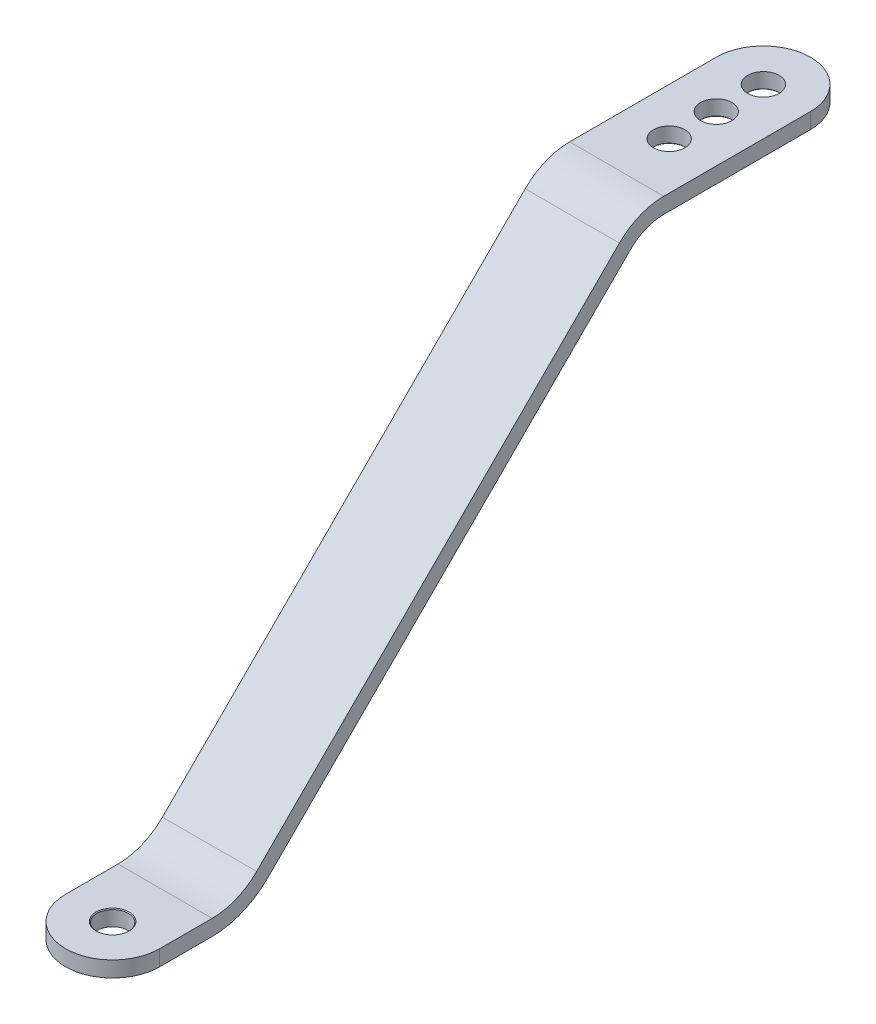
ISO-10303-21;
HEADER;
FILE_DESCRIPTION(('STEP AP214'),'2;1');
FILE_NAME('part.step','',(''),(''),'','','');
FILE_SCHEMA(('AUTOMOTIVE_DESIGN { 1 0 10303 214 1 1 1 1 }'));
ENDSEC;
DATA;
#1=APPLICATION_CONTEXT('core data for automotive mechanical design processes');
#2=APPLICATION_PROTOCOL_DEFINITION('international standard','automotive_design',2000,#1);
#3=PRODUCT_CONTEXT('',#1,'mechanical');
#4=PRODUCT('Part','Part','',(#3));
#5=PRODUCT_RELATED_PRODUCT_CATEGORY('part','',(#4));
#6=PRODUCT_DEFINITION_FORMATION('','',#4);
#7=PRODUCT_DEFINITION_CONTEXT('part definition',#1,'design');
#8=PRODUCT_DEFINITION('design','',#6,#7);
#9=PRODUCT_DEFINITION_SHAPE('','',#8);
#10=(LENGTH_UNIT() NAMED_UNIT(*) SI_UNIT(.MILLI.,.METRE.));
#11=(NAMED_UNIT(*) PLANE_ANGLE_UNIT() SI_UNIT($,.RADIAN.));
#12=(NAMED_UNIT(*) SI_UNIT($,.STERADIAN.) SOLID_ANGLE_UNIT());
#13=UNCERTAINTY_MEASURE_WITH_UNIT(LENGTH_MEASURE(1.E-05),#10,'distance_accuracy_value','');
#14=(GEOMETRIC_REPRESENTATION_CONTEXT(3) GLOBAL_UNCERTAINTY_ASSIGNED_CONTEXT((#13)) GLOBAL_UNIT_ASSIGNED_CONTEXT((#10,
#11,#12)) REPRESENTATION_CONTEXT('',''));
#15=CARTESIAN_POINT('',(0.,0.,0.));
#16=DIRECTION('',(0.,0.,1.));
#17=DIRECTION('',(1.,0.,0.));
#18=AXIS2_PLACEMENT_3D('',#15,#16,#17);
#19=CARTESIAN_POINT('',(38.1,323.28922035849,-301.344610179244));
#20=DIRECTION('',(0.,1.,0.));
#21=DIRECTION('',(0.,0.,1.));
#22=AXIS2_PLACEMENT_3D('',#19,#20,#21);
#23=CYLINDRICAL_SURFACE('',#22,38.1);
#24=DIRECTION('',(0.,1.,0.));
#25=VECTOR('',#24,1.);
#26=CARTESIAN_POINT('',(0.,50.8,-301.344610179244));
#27=LINE('',#26,#25);
#28=CARTESIAN_POINT('',(0.,323.28922035849,-301.344610179244));
#29=VERTEX_POINT('',#28);
#30=CARTESIAN_POINT('',(0.,310.58922035849,-301.344610179244));
#31=VERTEX_POINT('',#30);
#32=EDGE_CURVE('E218',#29,#31,#27,.F.);
#33=ORIENTED_EDGE('',*,*,#32,.F.);
#34=CARTESIAN_POINT('',(38.1,323.28922035849,-301.344610179244));
#35=DIRECTION('',(0.,-1.,0.));
#36=DIRECTION('',(0.,0.,-1.));
#37=AXIS2_PLACEMENT_3D('',#34,#35,#36);
#38=CIRCLE('',#37,38.1);
#39=CARTESIAN_POINT('',(76.2,323.28922035849,-301.344610179244));
#40=VERTEX_POINT('',#39);
#41=EDGE_CURVE('E47',#40,#29,#38,.F.);
#42=ORIENTED_EDGE('',*,*,#41,.F.);
#43=DIRECTION('',(0.,-1.,0.));
#44=VECTOR('',#43,1.);
#45=CARTESIAN_POINT('',(76.2,323.28922035849,-301.344610179244));
#46=LINE('',#45,#44);
#47=CARTESIAN_POINT('',(76.2,310.58922035849,-301.344610179244));
#48=VERTEX_POINT('',#47);
#49=EDGE_CURVE('E225',#48,#40,#46,.F.);
#50=ORIENTED_EDGE('',*,*,#49,.F.);
#51=CARTESIAN_POINT('',(38.1,310.58922035849,-301.344610179244));
#52=DIRECTION('',(0.,1.,0.));
#53=DIRECTION('',(0.,0.,1.));
#54=AXIS2_PLACEMENT_3D('',#51,#52,#53);
#55=CIRCLE('',#54,38.1);
#56=EDGE_CURVE('E11',#31,#48,#55,.F.);
#57=ORIENTED_EDGE('',*,*,#56,.F.);
#58=EDGE_LOOP('',(#33,#42,#50,#57));
#59=FACE_BOUND('',#58,.T.);
#60=ADVANCED_FACE('F41',(#59),#23,.T.);
#61=CARTESIAN_POINT('',(38.1,0.,225.144610179244));
#62=DIRECTION('',(0.,-1.,0.));
#63=DIRECTION('',(0.,0.,-1.));
#64=AXIS2_PLACEMENT_3D('',#61,#62,#63);
#65=CYLINDRICAL_SURFACE('',#64,38.1);
#66=DIRECTION('',(0.,1.,0.));
#67=VECTOR('',#66,1.);
#68=CARTESIAN_POINT('',(76.2,0.,225.144610179244));
#69=LINE('',#68,#67);
#70=CARTESIAN_POINT('',(76.2,0.,225.144610179244));
#71=VERTEX_POINT('',#70);
#72=CARTESIAN_POINT('',(76.2,-12.7,225.144610179244));
#73=VERTEX_POINT('',#72);
#74=EDGE_CURVE('E140',#71,#73,#69,.F.);
#75=ORIENTED_EDGE('',*,*,#74,.F.);
#76=CARTESIAN_POINT('',(38.1,0.,225.144610179244));
#77=DIRECTION('',(0.,-1.,0.));
#78=DIRECTION('',(0.,0.,-1.));
#79=AXIS2_PLACEMENT_3D('',#76,#77,#78);
#80=CIRCLE('',#79,38.1);
#81=CARTESIAN_POINT('',(0.,0.,225.144610179244));
#82=VERTEX_POINT('',#81);
#83=EDGE_CURVE('E214',#82,#71,#80,.F.);
#84=ORIENTED_EDGE('',*,*,#83,.F.);
#85=DIRECTION('',(0.,-1.,0.));
#86=VECTOR('',#85,1.);
#87=CARTESIAN_POINT('',(0.,50.8,225.144610179244));
#88=LINE('',#87,#86);
#89=CARTESIAN_POINT('',(0.,-12.7,225.144610179244));
#90=VERTEX_POINT('',#89);
#91=EDGE_CURVE('E215',#90,#82,#88,.F.);
#92=ORIENTED_EDGE('',*,*,#91,.F.);
#93=CARTESIAN_POINT('',(38.1,-12.7,225.144610179244));
#94=DIRECTION('',(0.,1.,0.));
#95=DIRECTION('',(0.,0.,1.));
#96=AXIS2_PLACEMENT_3D('',#93,#94,#95);
#97=CIRCLE('',#96,38.1);
#98=EDGE_CURVE('E220',#73,#90,#97,.F.);
#99=ORIENTED_EDGE('',*,*,#98,.F.);
#100=EDGE_LOOP('',(#75,#84,#92,#99));
#101=FACE_BOUND('',#100,.T.);
#102=ADVANCED_FACE('F263',(#101),#65,.T.);
#103=CARTESIAN_POINT('',(76.2,-12.7,263.244610179244));
#104=DIRECTION('',(0.,1.,0.));
#105=DIRECTION('',(0.,0.,1.));
#106=AXIS2_PLACEMENT_3D('',#103,#104,#105);
#107=PLANE('',#106);
#108=CARTESIAN_POINT('',(38.1,-12.7000000000002,225.144610179244));
#109=DIRECTION('',(0.,1.,0.));
#110=DIRECTION('',(0.,0.,1.));
#111=AXIS2_PLACEMENT_3D('',#108,#109,#110);
#112=CIRCLE('',#111,12.7);
#113=CARTESIAN_POINT('',(38.1,-12.7000000000002,237.844610179244));
#114=VERTEX_POINT('',#113);
#115=EDGE_CURVE('E172',#114,#114,#112,.T.);
#116=ORIENTED_EDGE('',*,*,#115,.T.);
#117=EDGE_LOOP('',(#116));
#118=FACE_BOUND('',#117,.T.);
#119=DIRECTION('',(0.,0.,-1.));
#120=VECTOR('',#119,1.);
#121=CARTESIAN_POINT('',(76.2,-12.7,263.244610179244));
#122=LINE('',#121,#120);
#123=CARTESIAN_POINT('',(76.2,-12.7,182.686659147798));
#124=VERTEX_POINT('',#123);
#125=EDGE_CURVE('E126',#73,#124,#122,.T.);
#126=ORIENTED_EDGE('',*,*,#125,.F.);
#127=ORIENTED_EDGE('',*,*,#98,.T.);
#128=DIRECTION('',(0.,0.,-1.));
#129=VECTOR('',#128,1.);
#130=CARTESIAN_POINT('',(0.,-12.7,263.244610179244));
#131=LINE('',#130,#129);
#132=CARTESIAN_POINT('',(0.,-12.7,182.686659147798));
#133=VERTEX_POINT('',#132);
#134=EDGE_CURVE('E144',#90,#133,#131,.T.);
#135=ORIENTED_EDGE('',*,*,#134,.T.);
#136=DIRECTION('',(-1.,0.,0.));
#137=VECTOR('',#136,1.);
#138=CARTESIAN_POINT('',(76.2,-12.7,182.686659147798));
#139=LINE('',#138,#137);
#140=EDGE_CURVE('E142',#124,#133,#139,.T.);
#141=ORIENTED_EDGE('',*,*,#140,.F.);
#142=EDGE_LOOP('',(#126,#127,#135,#141));
#143=FACE_BOUND('',#142,.T.);
#144=ADVANCED_FACE('F141',(#118,#143),#107,.F.);
#145=CARTESIAN_POINT('',(76.2,50.8,182.686659147798));
#146=DIRECTION('',(-1.,0.,0.));
#147=DIRECTION('',(0.,0.,1.));
#148=AXIS2_PLACEMENT_3D('',#145,#146,#147);
#149=CYLINDRICAL_SURFACE('',#148,63.5);
#150=CARTESIAN_POINT('',(0.,50.8,182.686659147798));
#151=DIRECTION('',(1.,0.,0.));
#152=DIRECTION('',(0.,0.,-1.));
#153=AXIS2_PLACEMENT_3D('',#150,#151,#152);
#154=CIRCLE('',#153,63.5);
#155=CARTESIAN_POINT('',(0.,5.89871939465449,137.785378542452));
#156=VERTEX_POINT('',#155);
#157=EDGE_CURVE('E173',#133,#156,#154,.T.);
#158=ORIENTED_EDGE('',*,*,#157,.T.);
#159=DIRECTION('',(-1.,0.,0.));
#160=VECTOR('',#159,1.);
#161=CARTESIAN_POINT('',(76.2,5.89871939465449,137.785378542452));
#162=LINE('',#161,#160);
#163=CARTESIAN_POINT('',(76.2,5.89871939465449,137.785378542452));
#164=VERTEX_POINT('',#163);
#165=EDGE_CURVE('E146',#164,#156,#162,.T.);
#166=ORIENTED_EDGE('',*,*,#165,.F.);
#167=CARTESIAN_POINT('',(76.2,50.8,182.686659147798));
#168=DIRECTION('',(1.,0.,0.));
#169=DIRECTION('',(0.,0.,-1.));
#170=AXIS2_PLACEMENT_3D('',#167,#168,#169);
#171=CIRCLE('',#170,63.5);
#172=EDGE_CURVE('E135',#124,#164,#171,.T.);
#173=ORIENTED_EDGE('',*,*,#172,.F.);
#174=ORIENTED_EDGE('',*,*,#140,.T.);
#175=EDGE_LOOP('',(#158,#166,#173,#174));
#176=FACE_BOUND('',#175,.T.);
#177=ADVANCED_FACE('F147',(#176),#149,.T.);
#178=CARTESIAN_POINT('',(76.2,5.89871939465449,137.785378542452));
#179=DIRECTION('',(0.,0.707106781186547,0.707106781186548));
#180=DIRECTION('',(0.,-0.707106781186548,0.707106781186547));
#181=AXIS2_PLACEMENT_3D('',#178,#179,#180);
#182=PLANE('',#181);
#183=DIRECTION('',(0.,0.707106781186548,-0.707106781186547));
#184=VECTOR('',#183,1.);
#185=CARTESIAN_POINT('',(0.,5.89871939465449,137.785378542452));
#186=LINE('',#185,#184);
#187=CARTESIAN_POINT('',(0.,299.429988721697,-155.74589078459));
#188=VERTEX_POINT('',#187);
#189=EDGE_CURVE('E180',#156,#188,#186,.T.);
#190=ORIENTED_EDGE('',*,*,#189,.T.);
#191=DIRECTION('',(-1.,0.,0.));
#192=VECTOR('',#191,1.);
#193=CARTESIAN_POINT('',(76.2,299.429988721697,-155.74589078459));
#194=LINE('',#193,#192);
#195=CARTESIAN_POINT('',(76.2,299.429988721697,-155.74589078459));
#196=VERTEX_POINT('',#195);
#197=EDGE_CURVE('E210',#196,#188,#194,.T.);
#198=ORIENTED_EDGE('',*,*,#197,.F.);
#199=DIRECTION('',(0.,0.707106781186548,-0.707106781186547));
#200=VECTOR('',#199,1.);
#201=CARTESIAN_POINT('',(76.2,5.89871939465449,137.785378542452));
#202=LINE('',#201,#200);
#203=EDGE_CURVE('E153',#164,#196,#202,.T.);
#204=ORIENTED_EDGE('',*,*,#203,.F.);
#205=ORIENTED_EDGE('',*,*,#165,.T.);
#206=EDGE_LOOP('',(#190,#198,#204,#205));
#207=FACE_BOUND('',#206,.T.);
#208=ADVANCED_FACE('F251',(#207),#182,.F.);
#209=CARTESIAN_POINT('',(76.2,272.48922035849,-182.686659147798));
#210=DIRECTION('',(-1.,0.,0.));
#211=DIRECTION('',(0.,0.,1.));
#212=AXIS2_PLACEMENT_3D('',#209,#210,#211);
#213=CYLINDRICAL_SURFACE('',#212,38.0999999999996);
#214=CARTESIAN_POINT('',(0.,272.48922035849,-182.686659147798));
#215=DIRECTION('',(-1.,0.,0.));
#216=DIRECTION('',(0.,0.,1.));
#217=AXIS2_PLACEMENT_3D('',#214,#215,#216);
#218=CIRCLE('',#217,38.0999999999996);
#219=CARTESIAN_POINT('',(0.,310.58922035849,-182.686659147798));
#220=VERTEX_POINT('',#219);
#221=EDGE_CURVE('E178',#188,#220,#218,.T.);
#222=ORIENTED_EDGE('',*,*,#221,.T.);
#223=DIRECTION('',(-1.,0.,0.));
#224=VECTOR('',#223,1.);
#225=CARTESIAN_POINT('',(76.2,310.58922035849,-182.686659147798));
#226=LINE('',#225,#224);
#227=CARTESIAN_POINT('',(76.2,310.58922035849,-182.686659147798));
#228=VERTEX_POINT('',#227);
#229=EDGE_CURVE('E204',#228,#220,#226,.T.);
#230=ORIENTED_EDGE('',*,*,#229,.F.);
#231=CARTESIAN_POINT('',(76.2,272.48922035849,-182.686659147798));
#232=DIRECTION('',(-1.,0.,0.));
#233=DIRECTION('',(0.,0.,1.));
#234=AXIS2_PLACEMENT_3D('',#231,#232,#233);
#235=CIRCLE('',#234,38.0999999999996);
#236=EDGE_CURVE('E154',#196,#228,#235,.T.);
#237=ORIENTED_EDGE('',*,*,#236,.F.);
#238=ORIENTED_EDGE('',*,*,#197,.T.);
#239=EDGE_LOOP('',(#222,#230,#237,#238));
#240=FACE_BOUND('',#239,.T.);
#241=ADVANCED_FACE('F249',(#240),#213,.F.);
#242=CARTESIAN_POINT('',(76.2,310.58922035849,-182.686659147798));
#243=DIRECTION('',(0.,1.,0.));
#244=DIRECTION('',(0.,0.,1.));
#245=AXIS2_PLACEMENT_3D('',#242,#243,#244);
#246=PLANE('',#245);
#247=CARTESIAN_POINT('',(38.1,310.58922035849,-225.144610179244));
#248=DIRECTION('',(0.,-1.,0.));
#249=DIRECTION('',(0.,0.,-1.));
#250=AXIS2_PLACEMENT_3D('',#247,#248,#249);
#251=CIRCLE('',#250,13.335);
#252=CARTESIAN_POINT('',(38.1,310.58922035849,-238.479610179244));
#253=VERTEX_POINT('',#252);
#254=EDGE_CURVE('E309',#253,#253,#251,.T.);
#255=ORIENTED_EDGE('',*,*,#254,.F.);
#256=EDGE_LOOP('',(#255));
#257=FACE_BOUND('',#256,.T.);
#258=CARTESIAN_POINT('',(38.1,310.58922035849,-263.244610179244));
#259=DIRECTION('',(0.,-1.,0.));
#260=DIRECTION('',(0.,0.,-1.));
#261=AXIS2_PLACEMENT_3D('',#258,#259,#260);
#262=CIRCLE('',#261,13.335);
#263=CARTESIAN_POINT('',(38.1,310.58922035849,-276.579610179244));
#264=VERTEX_POINT('',#263);
#265=EDGE_CURVE('E314',#264,#264,#262,.T.);
#266=ORIENTED_EDGE('',*,*,#265,.F.);
#267=EDGE_LOOP('',(#266));
#268=FACE_BOUND('',#267,.T.);
#269=CARTESIAN_POINT('',(38.1,310.58922035849,-301.344610179244));
#270=DIRECTION('',(0.,-1.,0.));
#271=DIRECTION('',(0.,0.,-1.));
#272=AXIS2_PLACEMENT_3D('',#269,#270,#271);
#273=CIRCLE('',#272,13.335);
#274=CARTESIAN_POINT('',(38.1,310.58922035849,-314.679610179244));
#275=VERTEX_POINT('',#274);
#276=EDGE_CURVE('E320',#275,#275,#273,.T.);
#277=ORIENTED_EDGE('',*,*,#276,.F.);
#278=EDGE_LOOP('',(#277));
#279=FACE_BOUND('',#278,.T.);
#280=DIRECTION('',(0.,0.,-1.));
#281=VECTOR('',#280,1.);
#282=CARTESIAN_POINT('',(0.,310.58922035849,-182.686659147798));
#283=LINE('',#282,#281);
#284=EDGE_CURVE('E182',#220,#31,#283,.T.);
#285=ORIENTED_EDGE('',*,*,#284,.T.);
#286=ORIENTED_EDGE('',*,*,#56,.T.);
#287=DIRECTION('',(0.,0.,-1.));
#288=VECTOR('',#287,1.);
#289=CARTESIAN_POINT('',(76.2,310.58922035849,-182.686659147798));
#290=LINE('',#289,#288);
#291=EDGE_CURVE('E159',#228,#48,#290,.T.);
#292=ORIENTED_EDGE('',*,*,#291,.F.);
#293=ORIENTED_EDGE('',*,*,#229,.T.);
#294=EDGE_LOOP('',(#285,#286,#292,#293));
#295=FACE_BOUND('',#294,.T.);
#296=ADVANCED_FACE('F246',(#257,#268,#279,#295),#246,.F.);
#297=CARTESIAN_POINT('',(76.2,323.28922035849,-182.686659147798));
#298=DIRECTION('',(0.,-1.,0.));
#299=DIRECTION('',(0.,0.,-1.));
#300=AXIS2_PLACEMENT_3D('',#297,#298,#299);
#301=PLANE('',#300);
#302=CARTESIAN_POINT('',(38.1,323.28922035849,-225.144610179244));
#303=DIRECTION('',(0.,-1.,0.));
#304=DIRECTION('',(0.,0.,-1.));
#305=AXIS2_PLACEMENT_3D('',#302,#303,#304);
#306=CIRCLE('',#305,12.7);
#307=CARTESIAN_POINT('',(38.1,323.28922035849,-237.844610179244));
#308=VERTEX_POINT('',#307);
#309=EDGE_CURVE('E448',#308,#308,#306,.T.);
#310=ORIENTED_EDGE('',*,*,#309,.T.);
#311=EDGE_LOOP('',(#310));
#312=FACE_BOUND('',#311,.T.);
#313=CARTESIAN_POINT('',(38.1,323.28922035849,-263.244610179244));
#314=DIRECTION('',(0.,-1.,0.));
#315=DIRECTION('',(0.,0.,-1.));
#316=AXIS2_PLACEMENT_3D('',#313,#314,#315);
#317=CIRCLE('',#316,12.7);
#318=CARTESIAN_POINT('',(38.1,323.28922035849,-275.944610179244));
#319=VERTEX_POINT('',#318);
#320=EDGE_CURVE('E319',#319,#319,#317,.T.);
#321=ORIENTED_EDGE('',*,*,#320,.T.);
#322=EDGE_LOOP('',(#321));
#323=FACE_BOUND('',#322,.T.);
#324=CARTESIAN_POINT('',(38.1,323.28922035849,-301.344610179244));
#325=DIRECTION('',(0.,-1.,0.));
#326=DIRECTION('',(0.,0.,-1.));
#327=AXIS2_PLACEMENT_3D('',#324,#325,#326);
#328=CIRCLE('',#327,12.7);
#329=CARTESIAN_POINT('',(38.1,323.28922035849,-314.044610179244));
#330=VERTEX_POINT('',#329);
#331=EDGE_CURVE('E323',#330,#330,#328,.T.);
#332=ORIENTED_EDGE('',*,*,#331,.T.);
#333=EDGE_LOOP('',(#332));
#334=FACE_BOUND('',#333,.T.);
#335=DIRECTION('',(0.,0.,1.));
#336=VECTOR('',#335,1.);
#337=CARTESIAN_POINT('',(76.2,323.28922035849,-182.686659147798));
#338=LINE('',#337,#336);
#339=CARTESIAN_POINT('',(76.2,323.28922035849,-182.686659147798));
#340=VERTEX_POINT('',#339);
#341=EDGE_CURVE('E165',#40,#340,#338,.T.);
#342=ORIENTED_EDGE('',*,*,#341,.F.);
#343=ORIENTED_EDGE('',*,*,#41,.T.);
#344=DIRECTION('',(0.,0.,1.));
#345=VECTOR('',#344,1.);
#346=CARTESIAN_POINT('',(0.,323.28922035849,-182.686659147798));
#347=LINE('',#346,#345);
#348=CARTESIAN_POINT('',(0.,323.28922035849,-182.686659147798));
#349=VERTEX_POINT('',#348);
#350=EDGE_CURVE('E181',#29,#349,#347,.T.);
#351=ORIENTED_EDGE('',*,*,#350,.T.);
#352=DIRECTION('',(-1.,0.,0.));
#353=VECTOR('',#352,1.);
#354=CARTESIAN_POINT('',(76.2,323.28922035849,-182.686659147798));
#355=LINE('',#354,#353);
#356=EDGE_CURVE('E203',#340,#349,#355,.T.);
#357=ORIENTED_EDGE('',*,*,#356,.F.);
#358=EDGE_LOOP('',(#342,#343,#351,#357));
#359=FACE_BOUND('',#358,.T.);
#360=ADVANCED_FACE('F223',(#312,#323,#334,#359),#301,.F.);
#361=CARTESIAN_POINT('',(76.2,272.48922035849,-182.686659147798));
#362=DIRECTION('',(-1.,0.,0.));
#363=DIRECTION('',(0.,0.,1.));
#364=AXIS2_PLACEMENT_3D('',#361,#362,#363);
#365=CYLINDRICAL_SURFACE('',#364,50.8);
#366=CARTESIAN_POINT('',(0.,272.48922035849,-182.686659147798));
#367=DIRECTION('',(1.,0.,0.));
#368=DIRECTION('',(0.,0.,1.));
#369=AXIS2_PLACEMENT_3D('',#366,#367,#368);
#370=CIRCLE('',#369,50.8);
#371=CARTESIAN_POINT('',(0.,308.410244842767,-146.765634663521));
#372=VERTEX_POINT('',#371);
#373=EDGE_CURVE('E183',#349,#372,#370,.T.);
#374=ORIENTED_EDGE('',*,*,#373,.T.);
#375=DIRECTION('',(-1.,0.,0.));
#376=VECTOR('',#375,1.);
#377=CARTESIAN_POINT('',(76.2,308.410244842767,-146.765634663521));
#378=LINE('',#377,#376);
#379=CARTESIAN_POINT('',(76.2,308.410244842767,-146.765634663521));
#380=VERTEX_POINT('',#379);
#381=EDGE_CURVE('E196',#380,#372,#378,.T.);
#382=ORIENTED_EDGE('',*,*,#381,.F.);
#383=CARTESIAN_POINT('',(76.2,272.48922035849,-182.686659147798));
#384=DIRECTION('',(1.,0.,0.));
#385=DIRECTION('',(0.,0.,1.));
#386=AXIS2_PLACEMENT_3D('',#383,#384,#385);
#387=CIRCLE('',#386,50.8);
#388=EDGE_CURVE('E163',#340,#380,#387,.T.);
#389=ORIENTED_EDGE('',*,*,#388,.F.);
#390=ORIENTED_EDGE('',*,*,#356,.T.);
#391=EDGE_LOOP('',(#374,#382,#389,#390));
#392=FACE_BOUND('',#391,.T.);
#393=ADVANCED_FACE('F237',(#392),#365,.T.);
#394=CARTESIAN_POINT('',(76.2,14.8789755157236,146.765634663521));
#395=DIRECTION('',(0.,-0.707106781186546,-0.707106781186549));
#396=DIRECTION('',(0.,0.707106781186549,-0.707106781186546));
#397=AXIS2_PLACEMENT_3D('',#394,#395,#396);
#398=PLANE('',#397);
#399=DIRECTION('',(0.,-0.707106781186549,0.707106781186546));
#400=VECTOR('',#399,1.);
#401=CARTESIAN_POINT('',(0.,14.8789755157236,146.765634663521));
#402=LINE('',#401,#400);
#403=CARTESIAN_POINT('',(0.,14.8789755157236,146.765634663521));
#404=VERTEX_POINT('',#403);
#405=EDGE_CURVE('E186',#372,#404,#402,.T.);
#406=ORIENTED_EDGE('',*,*,#405,.T.);
#407=DIRECTION('',(-1.,0.,0.));
#408=VECTOR('',#407,1.);
#409=CARTESIAN_POINT('',(76.2,14.8789755157236,146.765634663521));
#410=LINE('',#409,#408);
#411=CARTESIAN_POINT('',(76.2,14.8789755157236,146.765634663521));
#412=VERTEX_POINT('',#411);
#413=EDGE_CURVE('E194',#412,#404,#410,.T.);
#414=ORIENTED_EDGE('',*,*,#413,.F.);
#415=DIRECTION('',(0.,-0.707106781186549,0.707106781186546));
#416=VECTOR('',#415,1.);
#417=CARTESIAN_POINT('',(76.2,14.8789755157236,146.765634663521));
#418=LINE('',#417,#416);
#419=EDGE_CURVE('E167',#380,#412,#418,.T.);
#420=ORIENTED_EDGE('',*,*,#419,.F.);
#421=ORIENTED_EDGE('',*,*,#381,.T.);
#422=EDGE_LOOP('',(#406,#414,#420,#421));
#423=FACE_BOUND('',#422,.T.);
#424=ADVANCED_FACE('F238',(#423),#398,.F.);
#425=CARTESIAN_POINT('',(76.2,50.8,182.686659147798));
#426=DIRECTION('',(-1.,0.,0.));
#427=DIRECTION('',(0.,0.,1.));
#428=AXIS2_PLACEMENT_3D('',#425,#426,#427);
#429=CYLINDRICAL_SURFACE('',#428,50.8);
#430=CARTESIAN_POINT('',(0.,50.8,182.686659147798));
#431=DIRECTION('',(-1.,0.,0.));
#432=DIRECTION('',(0.,0.,-1.));
#433=AXIS2_PLACEMENT_3D('',#430,#431,#432);
#434=CIRCLE('',#433,50.8);
#435=CARTESIAN_POINT('',(0.,0.,182.686659147798));
#436=VERTEX_POINT('',#435);
#437=EDGE_CURVE('E188',#404,#436,#434,.T.);
#438=ORIENTED_EDGE('',*,*,#437,.T.);
#439=DIRECTION('',(-1.,0.,0.));
#440=VECTOR('',#439,1.);
#441=CARTESIAN_POINT('',(76.2,0.,182.686659147798));
#442=LINE('',#441,#440);
#443=CARTESIAN_POINT('',(76.2,0.,182.686659147798));
#444=VERTEX_POINT('',#443);
#445=EDGE_CURVE('E171',#444,#436,#442,.T.);
#446=ORIENTED_EDGE('',*,*,#445,.F.);
#447=CARTESIAN_POINT('',(76.2,50.8,182.686659147798));
#448=DIRECTION('',(-1.,0.,0.));
#449=DIRECTION('',(0.,0.,-1.));
#450=AXIS2_PLACEMENT_3D('',#447,#448,#449);
#451=CIRCLE('',#450,50.8);
#452=EDGE_CURVE('E169',#412,#444,#451,.T.);
#453=ORIENTED_EDGE('',*,*,#452,.F.);
#454=ORIENTED_EDGE('',*,*,#413,.T.);
#455=EDGE_LOOP('',(#438,#446,#453,#454));
#456=FACE_BOUND('',#455,.T.);
#457=ADVANCED_FACE('F286',(#456),#429,.F.);
#458=CARTESIAN_POINT('',(76.2,0.,263.244610179244));
#459=DIRECTION('',(0.,-1.,0.));
#460=DIRECTION('',(0.,0.,-1.));
#461=AXIS2_PLACEMENT_3D('',#458,#459,#460);
#462=PLANE('',#461);
#463=CARTESIAN_POINT('',(38.1,0.,225.144610179244));
#464=DIRECTION('',(0.,1.,0.));
#465=DIRECTION('',(0.,0.,1.));
#466=AXIS2_PLACEMENT_3D('',#463,#464,#465);
#467=CIRCLE('',#466,13.335);
#468=CARTESIAN_POINT('',(38.1,0.,238.479610179245));
#469=VERTEX_POINT('',#468);
#470=EDGE_CURVE('E335',#469,#469,#467,.T.);
#471=ORIENTED_EDGE('',*,*,#470,.F.);
#472=EDGE_LOOP('',(#471));
#473=FACE_BOUND('',#472,.T.);
#474=DIRECTION('',(0.,0.,1.));
#475=VECTOR('',#474,1.);
#476=CARTESIAN_POINT('',(0.,0.,263.244610179244));
#477=LINE('',#476,#475);
#478=EDGE_CURVE('E138',#436,#82,#477,.T.);
#479=ORIENTED_EDGE('',*,*,#478,.T.);
#480=ORIENTED_EDGE('',*,*,#83,.T.);
#481=DIRECTION('',(0.,0.,1.));
#482=VECTOR('',#481,1.);
#483=CARTESIAN_POINT('',(76.2,0.,263.244610179244));
#484=LINE('',#483,#482);
#485=EDGE_CURVE('E168',#444,#71,#484,.T.);
#486=ORIENTED_EDGE('',*,*,#485,.F.);
#487=ORIENTED_EDGE('',*,*,#445,.T.);
#488=EDGE_LOOP('',(#479,#480,#486,#487));
#489=FACE_BOUND('',#488,.T.);
#490=ADVANCED_FACE('F285',(#473,#489),#462,.F.);
#491=CARTESIAN_POINT('',(76.2,50.8,182.686659147798));
#492=DIRECTION('',(1.,0.,0.));
#493=DIRECTION('',(0.,0.,-1.));
#494=AXIS2_PLACEMENT_3D('',#491,#492,#493);
#495=PLANE('',#494);
#496=ORIENTED_EDGE('',*,*,#291,.T.);
#497=ORIENTED_EDGE('',*,*,#49,.T.);
#498=ORIENTED_EDGE('',*,*,#341,.T.);
#499=ORIENTED_EDGE('',*,*,#388,.T.);
#500=ORIENTED_EDGE('',*,*,#419,.T.);
#501=ORIENTED_EDGE('',*,*,#452,.T.);
#502=ORIENTED_EDGE('',*,*,#485,.T.);
#503=ORIENTED_EDGE('',*,*,#74,.T.);
#504=ORIENTED_EDGE('',*,*,#125,.T.);
#505=ORIENTED_EDGE('',*,*,#172,.T.);
#506=ORIENTED_EDGE('',*,*,#203,.T.);
#507=ORIENTED_EDGE('',*,*,#236,.T.);
#508=EDGE_LOOP('',(#496,#497,#498,#499,#500,#501,#502,#503,#504,#505,#506,#507));
#509=FACE_BOUND('',#508,.T.);
#510=ADVANCED_FACE('F134',(#509),#495,.T.);
#511=CARTESIAN_POINT('',(0.,50.8,182.686659147798));
#512=DIRECTION('',(1.,0.,0.));
#513=DIRECTION('',(0.,0.,-1.));
#514=AXIS2_PLACEMENT_3D('',#511,#512,#513);
#515=PLANE('',#514);
#516=ORIENTED_EDGE('',*,*,#350,.F.);
#517=ORIENTED_EDGE('',*,*,#32,.T.);
#518=ORIENTED_EDGE('',*,*,#284,.F.);
#519=ORIENTED_EDGE('',*,*,#221,.F.);
#520=ORIENTED_EDGE('',*,*,#189,.F.);
#521=ORIENTED_EDGE('',*,*,#157,.F.);
#522=ORIENTED_EDGE('',*,*,#134,.F.);
#523=ORIENTED_EDGE('',*,*,#91,.T.);
#524=ORIENTED_EDGE('',*,*,#478,.F.);
#525=ORIENTED_EDGE('',*,*,#437,.F.);
#526=ORIENTED_EDGE('',*,*,#405,.F.);
#527=ORIENTED_EDGE('',*,*,#373,.F.);
#528=EDGE_LOOP('',(#516,#517,#518,#519,#520,#521,#522,#523,#524,#525,#526,#527));
#529=FACE_BOUND('',#528,.T.);
#530=ADVANCED_FACE('F231',(#529),#515,.F.);
#531=CARTESIAN_POINT('',(38.1,0.,225.144610179244));
#532=DIRECTION('',(0.,1.,0.));
#533=DIRECTION('',(0.,0.,1.));
#534=AXIS2_PLACEMENT_3D('',#531,#532,#533);
#535=CYLINDRICAL_SURFACE('',#534,12.7);
#536=ORIENTED_EDGE('',*,*,#115,.F.);
#537=EDGE_LOOP('',(#536));
#538=FACE_BOUND('',#537,.T.);
#539=CARTESIAN_POINT('',(38.1,-0.635000000000078,225.144610179244));
#540=DIRECTION('',(0.,1.,0.));
#541=DIRECTION('',(0.,0.,1.));
#542=AXIS2_PLACEMENT_3D('',#539,#540,#541);
#543=CIRCLE('',#542,12.7);
#544=CARTESIAN_POINT('',(38.1,-0.635000000000082,237.844610179244));
#545=VERTEX_POINT('',#544);
#546=EDGE_CURVE('E333',#545,#545,#543,.T.);
#547=ORIENTED_EDGE('',*,*,#546,.T.);
#548=EDGE_LOOP('',(#547));
#549=FACE_BOUND('',#548,.T.);
#550=ADVANCED_FACE('F337',(#538,#549),#535,.F.);
#551=CARTESIAN_POINT('',(38.1,0.,225.144610179244));
#552=DIRECTION('',(0.,1.,0.));
#553=DIRECTION('',(0.,0.,1.));
#554=AXIS2_PLACEMENT_3D('',#551,#552,#553);
#555=CONICAL_SURFACE('',#554,13.335,0.785398163397454);
#556=ORIENTED_EDGE('',*,*,#546,.F.);
#557=EDGE_LOOP('',(#556));
#558=FACE_BOUND('',#557,.T.);
#559=ORIENTED_EDGE('',*,*,#470,.T.);
#560=EDGE_LOOP('',(#559));
#561=FACE_BOUND('',#560,.T.);
#562=ADVANCED_FACE('F342',(#558,#561),#555,.F.);
#563=CARTESIAN_POINT('',(38.1,310.58922035849,-301.344610179244));
#564=DIRECTION('',(0.,-1.,0.));
#565=DIRECTION('',(0.,0.,-1.));
#566=AXIS2_PLACEMENT_3D('',#563,#564,#565);
#567=CYLINDRICAL_SURFACE('',#566,12.7);
#568=ORIENTED_EDGE('',*,*,#331,.F.);
#569=EDGE_LOOP('',(#568));
#570=FACE_BOUND('',#569,.T.);
#571=CARTESIAN_POINT('',(38.1,311.22422035849,-301.344610179244));
#572=DIRECTION('',(0.,-1.,0.));
#573=DIRECTION('',(0.,0.,-1.));
#574=AXIS2_PLACEMENT_3D('',#571,#572,#573);
#575=CIRCLE('',#574,12.7);
#576=CARTESIAN_POINT('',(38.1,311.22422035849,-314.044610179244));
#577=VERTEX_POINT('',#576);
#578=EDGE_CURVE('E317',#577,#577,#575,.T.);
#579=ORIENTED_EDGE('',*,*,#578,.T.);
#580=EDGE_LOOP('',(#579));
#581=FACE_BOUND('',#580,.T.);
#582=ADVANCED_FACE('F349',(#570,#581),#567,.F.);
#583=CARTESIAN_POINT('',(38.1,310.58922035849,-301.344610179244));
#584=DIRECTION('',(0.,-1.,0.));
#585=DIRECTION('',(0.,0.,-1.));
#586=AXIS2_PLACEMENT_3D('',#583,#584,#585);
#587=CONICAL_SURFACE('',#586,13.335,0.785398163397454);
#588=ORIENTED_EDGE('',*,*,#578,.F.);
#589=EDGE_LOOP('',(#588));
#590=FACE_BOUND('',#589,.T.);
#591=ORIENTED_EDGE('',*,*,#276,.T.);
#592=EDGE_LOOP('',(#591));
#593=FACE_BOUND('',#592,.T.);
#594=ADVANCED_FACE('F352',(#590,#593),#587,.F.);
#595=CARTESIAN_POINT('',(38.1,310.58922035849,-263.244610179244));
#596=DIRECTION('',(0.,-1.,0.));
#597=DIRECTION('',(0.,0.,-1.));
#598=AXIS2_PLACEMENT_3D('',#595,#596,#597);
#599=CYLINDRICAL_SURFACE('',#598,12.7);
#600=ORIENTED_EDGE('',*,*,#320,.F.);
#601=EDGE_LOOP('',(#600));
#602=FACE_BOUND('',#601,.T.);
#603=CARTESIAN_POINT('',(38.1,311.22422035849,-263.244610179244));
#604=DIRECTION('',(0.,-1.,0.));
#605=DIRECTION('',(0.,0.,-1.));
#606=AXIS2_PLACEMENT_3D('',#603,#604,#605);
#607=CIRCLE('',#606,12.7);
#608=CARTESIAN_POINT('',(38.1,311.22422035849,-275.944610179244));
#609=VERTEX_POINT('',#608);
#610=EDGE_CURVE('E326',#609,#609,#607,.T.);
#611=ORIENTED_EDGE('',*,*,#610,.T.);
#612=EDGE_LOOP('',(#611));
#613=FACE_BOUND('',#612,.T.);
#614=ADVANCED_FACE('F405',(#602,#613),#599,.F.);
#615=CARTESIAN_POINT('',(38.1,310.58922035849,-263.244610179244));
#616=DIRECTION('',(0.,-1.,0.));
#617=DIRECTION('',(0.,0.,-1.));
#618=AXIS2_PLACEMENT_3D('',#615,#616,#617);
#619=CONICAL_SURFACE('',#618,13.335,0.785398163397454);
#620=ORIENTED_EDGE('',*,*,#610,.F.);
#621=EDGE_LOOP('',(#620));
#622=FACE_BOUND('',#621,.T.);
#623=ORIENTED_EDGE('',*,*,#265,.T.);
#624=EDGE_LOOP('',(#623));
#625=FACE_BOUND('',#624,.T.);
#626=ADVANCED_FACE('F411',(#622,#625),#619,.F.);
#627=CARTESIAN_POINT('',(38.1,310.58922035849,-225.144610179244));
#628=DIRECTION('',(0.,-1.,0.));
#629=DIRECTION('',(0.,0.,-1.));
#630=AXIS2_PLACEMENT_3D('',#627,#628,#629);
#631=CYLINDRICAL_SURFACE('',#630,12.7);
#632=ORIENTED_EDGE('',*,*,#309,.F.);
#633=EDGE_LOOP('',(#632));
#634=FACE_BOUND('',#633,.T.);
#635=CARTESIAN_POINT('',(38.1,311.22422035849,-225.144610179244));
#636=DIRECTION('',(0.,-1.,0.));
#637=DIRECTION('',(0.,0.,-1.));
#638=AXIS2_PLACEMENT_3D('',#635,#636,#637);
#639=CIRCLE('',#638,12.7);
#640=CARTESIAN_POINT('',(38.1,311.22422035849,-237.844610179244));
#641=VERTEX_POINT('',#640);
#642=EDGE_CURVE('E446',#641,#641,#639,.T.);
#643=ORIENTED_EDGE('',*,*,#642,.T.);
#644=EDGE_LOOP('',(#643));
#645=FACE_BOUND('',#644,.T.);
#646=ADVANCED_FACE('F423',(#634,#645),#631,.F.);
#647=CARTESIAN_POINT('',(38.1,310.58922035849,-225.144610179244));
#648=DIRECTION('',(0.,-1.,0.));
#649=DIRECTION('',(0.,0.,-1.));
#650=AXIS2_PLACEMENT_3D('',#647,#648,#649);
#651=CONICAL_SURFACE('',#650,13.335,0.785398163397454);
#652=ORIENTED_EDGE('',*,*,#642,.F.);
#653=EDGE_LOOP('',(#652));
#654=FACE_BOUND('',#653,.T.);
#655=ORIENTED_EDGE('',*,*,#254,.T.);
#656=EDGE_LOOP('',(#655));
#657=FACE_BOUND('',#656,.T.);
#658=ADVANCED_FACE('F431',(#654,#657),#651,.F.);
#659=CLOSED_SHELL('',(#60,#102,#144,#177,#208,#241,#296,#360,#393,#424,#457,#490,#510,#530,#550,
#562,#582,#594,#614,#626,#646,#658));
#660=MANIFOLD_SOLID_BREP('B2',#659);
#661=ADVANCED_BREP_SHAPE_REPRESENTATION('',(#18,#660),#14);
#662=SHAPE_DEFINITION_REPRESENTATION(#9,#661);
ENDSEC;
END-ISO-10303-21;
